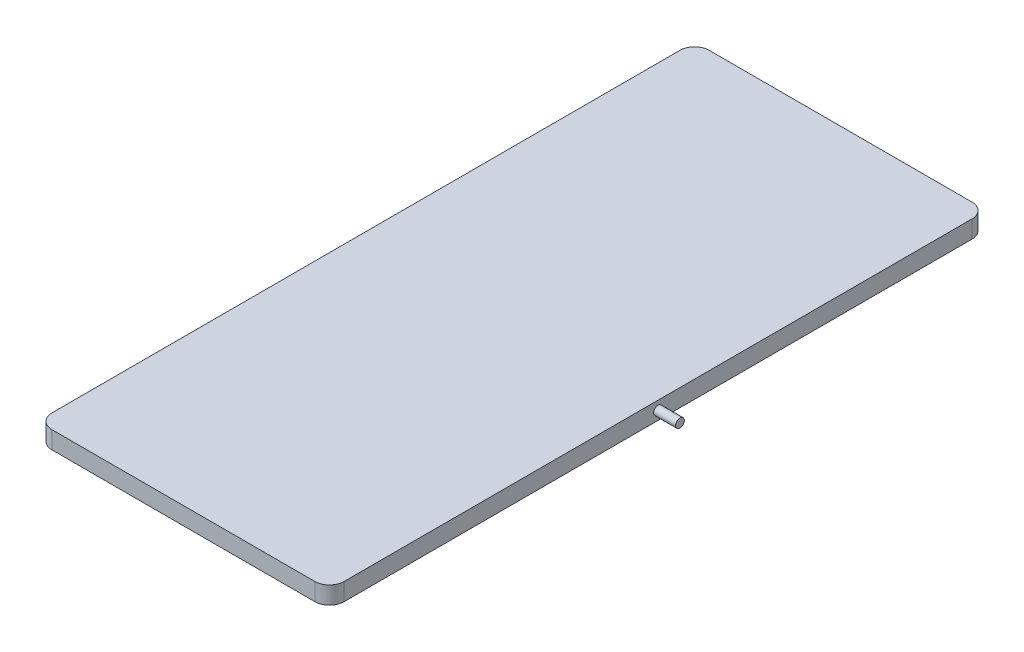
ISO-10303-21;
HEADER;
FILE_DESCRIPTION(('STEP AP214'),'2;1');
FILE_NAME('part.step','',(''),(''),'','','');
FILE_SCHEMA(('AUTOMOTIVE_DESIGN { 1 0 10303 214 1 1 1 1 }'));
ENDSEC;
DATA;
#1=APPLICATION_CONTEXT('core data for automotive mechanical design processes');
#2=APPLICATION_PROTOCOL_DEFINITION('international standard','automotive_design',2000,#1);
#3=PRODUCT_CONTEXT('',#1,'mechanical');
#4=PRODUCT('Part','Part','',(#3));
#5=PRODUCT_RELATED_PRODUCT_CATEGORY('part','',(#4));
#6=PRODUCT_DEFINITION_FORMATION('','',#4);
#7=PRODUCT_DEFINITION_CONTEXT('part definition',#1,'design');
#8=PRODUCT_DEFINITION('design','',#6,#7);
#9=PRODUCT_DEFINITION_SHAPE('','',#8);
#10=(LENGTH_UNIT() NAMED_UNIT(*) SI_UNIT(.MILLI.,.METRE.));
#11=(NAMED_UNIT(*) PLANE_ANGLE_UNIT() SI_UNIT($,.RADIAN.));
#12=(NAMED_UNIT(*) SI_UNIT($,.STERADIAN.) SOLID_ANGLE_UNIT());
#13=UNCERTAINTY_MEASURE_WITH_UNIT(LENGTH_MEASURE(1.E-05),#10,'distance_accuracy_value','');
#14=(GEOMETRIC_REPRESENTATION_CONTEXT(3) GLOBAL_UNCERTAINTY_ASSIGNED_CONTEXT((#13)) GLOBAL_UNIT_ASSIGNED_CONTEXT((#10,
#11,#12)) REPRESENTATION_CONTEXT('',''));
#15=CARTESIAN_POINT('',(0.,0.,0.));
#16=DIRECTION('',(0.,0.,1.));
#17=DIRECTION('',(1.,0.,0.));
#18=AXIS2_PLACEMENT_3D('',#15,#16,#17);
#19=CARTESIAN_POINT('',(-100.,12.,-450.));
#20=DIRECTION('',(1.,0.,0.));
#21=DIRECTION('',(0.,0.,-1.));
#22=AXIS2_PLACEMENT_3D('',#19,#20,#21);
#23=PLANE('',#22);
#24=DIRECTION('',(0.,0.,1.));
#25=VECTOR('',#24,1.);
#26=CARTESIAN_POINT('',(-100.,12.,-450.));
#27=LINE('',#26,#25);
#28=CARTESIAN_POINT('',(-100.,12.,-440.));
#29=VERTEX_POINT('',#28);
#30=CARTESIAN_POINT('',(-100.,12.,-10.));
#31=VERTEX_POINT('',#30);
#32=EDGE_CURVE('E127',#29,#31,#27,.T.);
#33=ORIENTED_EDGE('',*,*,#32,.F.);
#34=DIRECTION('',(0.,-1.,0.));
#35=VECTOR('',#34,1.);
#36=CARTESIAN_POINT('',(-100.,12.,-440.));
#37=LINE('',#36,#35);
#38=CARTESIAN_POINT('',(-100.,0.,-440.));
#39=VERTEX_POINT('',#38);
#40=EDGE_CURVE('E112',#29,#39,#37,.T.);
#41=ORIENTED_EDGE('',*,*,#40,.T.);
#42=DIRECTION('',(0.,0.,1.));
#43=VECTOR('',#42,1.);
#44=CARTESIAN_POINT('',(-100.,0.,-450.));
#45=LINE('',#44,#43);
#46=CARTESIAN_POINT('',(-100.,0.,-10.));
#47=VERTEX_POINT('',#46);
#48=EDGE_CURVE('E124',#39,#47,#45,.T.);
#49=ORIENTED_EDGE('',*,*,#48,.T.);
#50=DIRECTION('',(0.,-1.,0.));
#51=VECTOR('',#50,1.);
#52=CARTESIAN_POINT('',(-100.,12.,-10.));
#53=LINE('',#52,#51);
#54=EDGE_CURVE('E129',#47,#31,#53,.F.);
#55=ORIENTED_EDGE('',*,*,#54,.T.);
#56=EDGE_LOOP('',(#33,#41,#49,#55));
#57=FACE_BOUND('',#56,.T.);
#58=ADVANCED_FACE('F41',(#57),#23,.F.);
#59=CARTESIAN_POINT('',(-100.,12.,0.));
#60=DIRECTION('',(0.,0.,-1.));
#61=DIRECTION('',(-1.,0.,0.));
#62=AXIS2_PLACEMENT_3D('',#59,#60,#61);
#63=PLANE('',#62);
#64=DIRECTION('',(1.,0.,0.));
#65=VECTOR('',#64,1.);
#66=CARTESIAN_POINT('',(-100.,12.,0.));
#67=LINE('',#66,#65);
#68=CARTESIAN_POINT('',(-90.,12.,0.));
#69=VERTEX_POINT('',#68);
#70=CARTESIAN_POINT('',(90.,12.,0.));
#71=VERTEX_POINT('',#70);
#72=EDGE_CURVE('E174',#69,#71,#67,.T.);
#73=ORIENTED_EDGE('',*,*,#72,.F.);
#74=DIRECTION('',(0.,-1.,0.));
#75=VECTOR('',#74,1.);
#76=CARTESIAN_POINT('',(-90.,12.,0.));
#77=LINE('',#76,#75);
#78=CARTESIAN_POINT('',(-90.,0.,0.));
#79=VERTEX_POINT('',#78);
#80=EDGE_CURVE('E49',#69,#79,#77,.T.);
#81=ORIENTED_EDGE('',*,*,#80,.T.);
#82=DIRECTION('',(1.,0.,0.));
#83=VECTOR('',#82,1.);
#84=CARTESIAN_POINT('',(-100.,0.,0.));
#85=LINE('',#84,#83);
#86=CARTESIAN_POINT('',(90.,0.,0.));
#87=VERTEX_POINT('',#86);
#88=EDGE_CURVE('E134',#79,#87,#85,.T.);
#89=ORIENTED_EDGE('',*,*,#88,.T.);
#90=DIRECTION('',(0.,-1.,0.));
#91=VECTOR('',#90,1.);
#92=CARTESIAN_POINT('',(90.,12.,0.));
#93=LINE('',#92,#91);
#94=EDGE_CURVE('E167',#87,#71,#93,.F.);
#95=ORIENTED_EDGE('',*,*,#94,.T.);
#96=EDGE_LOOP('',(#73,#81,#89,#95));
#97=FACE_BOUND('',#96,.T.);
#98=ADVANCED_FACE('F172',(#97),#63,.F.);
#99=CARTESIAN_POINT('',(99.9999999999999,12.,-450.));
#100=DIRECTION('',(-1.,0.,0.));
#101=DIRECTION('',(0.,0.,1.));
#102=AXIS2_PLACEMENT_3D('',#99,#100,#101);
#103=PLANE('',#102);
#104=CARTESIAN_POINT('',(100.,6.00000000000001,-225.));
#105=DIRECTION('',(-1.,0.,0.));
#106=DIRECTION('',(0.,0.,1.));
#107=AXIS2_PLACEMENT_3D('',#104,#105,#106);
#108=CIRCLE('',#107,2.99999999999999);
#109=CARTESIAN_POINT('',(100.,6.00000000000001,-222.));
#110=VERTEX_POINT('',#109);
#111=EDGE_CURVE('E11',#110,#110,#108,.F.);
#112=ORIENTED_EDGE('',*,*,#111,.F.);
#113=EDGE_LOOP('',(#112));
#114=FACE_BOUND('',#113,.T.);
#115=DIRECTION('',(0.,0.,-1.));
#116=VECTOR('',#115,1.);
#117=CARTESIAN_POINT('',(99.9999999999999,0.,-450.));
#118=LINE('',#117,#116);
#119=CARTESIAN_POINT('',(100.,0.,-10.0000000000001));
#120=VERTEX_POINT('',#119);
#121=CARTESIAN_POINT('',(99.9999999999999,0.,-440.));
#122=VERTEX_POINT('',#121);
#123=EDGE_CURVE('E138',#120,#122,#118,.T.);
#124=ORIENTED_EDGE('',*,*,#123,.T.);
#125=DIRECTION('',(0.,-1.,0.));
#126=VECTOR('',#125,1.);
#127=CARTESIAN_POINT('',(99.9999999999999,12.,-440.));
#128=LINE('',#127,#126);
#129=CARTESIAN_POINT('',(99.9999999999999,12.,-440.));
#130=VERTEX_POINT('',#129);
#131=EDGE_CURVE('E56',#122,#130,#128,.F.);
#132=ORIENTED_EDGE('',*,*,#131,.T.);
#133=DIRECTION('',(0.,0.,-1.));
#134=VECTOR('',#133,1.);
#135=CARTESIAN_POINT('',(99.9999999999999,12.,-450.));
#136=LINE('',#135,#134);
#137=CARTESIAN_POINT('',(100.,12.,-10.0000000000001));
#138=VERTEX_POINT('',#137);
#139=EDGE_CURVE('E181',#138,#130,#136,.T.);
#140=ORIENTED_EDGE('',*,*,#139,.F.);
#141=DIRECTION('',(0.,-1.,0.));
#142=VECTOR('',#141,1.);
#143=CARTESIAN_POINT('',(100.,12.,-10.0000000000001));
#144=LINE('',#143,#142);
#145=EDGE_CURVE('E163',#138,#120,#144,.T.);
#146=ORIENTED_EDGE('',*,*,#145,.T.);
#147=EDGE_LOOP('',(#124,#132,#140,#146));
#148=FACE_BOUND('',#147,.T.);
#149=ADVANCED_FACE('F180',(#114,#148),#103,.F.);
#150=CARTESIAN_POINT('',(-100.,12.,-450.));
#151=DIRECTION('',(0.,0.,1.));
#152=DIRECTION('',(1.,0.,0.));
#153=AXIS2_PLACEMENT_3D('',#150,#151,#152);
#154=PLANE('',#153);
#155=DIRECTION('',(-1.,0.,0.));
#156=VECTOR('',#155,1.);
#157=CARTESIAN_POINT('',(-100.,0.,-450.));
#158=LINE('',#157,#156);
#159=CARTESIAN_POINT('',(89.9999999999999,0.,-450.));
#160=VERTEX_POINT('',#159);
#161=CARTESIAN_POINT('',(-90.0000000000001,0.,-450.));
#162=VERTEX_POINT('',#161);
#163=EDGE_CURVE('E147',#160,#162,#158,.T.);
#164=ORIENTED_EDGE('',*,*,#163,.T.);
#165=DIRECTION('',(0.,-1.,0.));
#166=VECTOR('',#165,1.);
#167=CARTESIAN_POINT('',(-90.0000000000001,12.,-450.));
#168=LINE('',#167,#166);
#169=CARTESIAN_POINT('',(-90.0000000000001,12.,-450.));
#170=VERTEX_POINT('',#169);
#171=EDGE_CURVE('E113',#162,#170,#168,.F.);
#172=ORIENTED_EDGE('',*,*,#171,.T.);
#173=DIRECTION('',(-1.,0.,0.));
#174=VECTOR('',#173,1.);
#175=CARTESIAN_POINT('',(-100.,12.,-450.));
#176=LINE('',#175,#174);
#177=CARTESIAN_POINT('',(89.9999999999999,12.,-450.));
#178=VERTEX_POINT('',#177);
#179=EDGE_CURVE('E143',#178,#170,#176,.T.);
#180=ORIENTED_EDGE('',*,*,#179,.F.);
#181=DIRECTION('',(0.,-1.,0.));
#182=VECTOR('',#181,1.);
#183=CARTESIAN_POINT('',(89.9999999999999,12.,-450.));
#184=LINE('',#183,#182);
#185=EDGE_CURVE('E118',#178,#160,#184,.T.);
#186=ORIENTED_EDGE('',*,*,#185,.T.);
#187=EDGE_LOOP('',(#164,#172,#180,#186));
#188=FACE_BOUND('',#187,.T.);
#189=ADVANCED_FACE('F213',(#188),#154,.F.);
#190=CARTESIAN_POINT('',(0.,12.,0.));
#191=DIRECTION('',(0.,1.,0.));
#192=DIRECTION('',(0.,0.,1.));
#193=AXIS2_PLACEMENT_3D('',#190,#191,#192);
#194=PLANE('',#193);
#195=ORIENTED_EDGE('',*,*,#179,.T.);
#196=CARTESIAN_POINT('',(-90.0000000000001,12.,-440.));
#197=DIRECTION('',(0.,1.,0.));
#198=DIRECTION('',(0.,0.,1.));
#199=AXIS2_PLACEMENT_3D('',#196,#197,#198);
#200=CIRCLE('',#199,10.);
#201=EDGE_CURVE('E161',#170,#29,#200,.T.);
#202=ORIENTED_EDGE('',*,*,#201,.T.);
#203=ORIENTED_EDGE('',*,*,#32,.T.);
#204=CARTESIAN_POINT('',(-90.,12.,-10.));
#205=DIRECTION('',(0.,1.,0.));
#206=DIRECTION('',(0.,0.,1.));
#207=AXIS2_PLACEMENT_3D('',#204,#205,#206);
#208=CIRCLE('',#207,10.);
#209=EDGE_CURVE('E157',#31,#69,#208,.T.);
#210=ORIENTED_EDGE('',*,*,#209,.T.);
#211=ORIENTED_EDGE('',*,*,#72,.T.);
#212=CARTESIAN_POINT('',(90.,12.,-10.0000000000001));
#213=DIRECTION('',(0.,1.,0.));
#214=DIRECTION('',(0.,0.,1.));
#215=AXIS2_PLACEMENT_3D('',#212,#213,#214);
#216=CIRCLE('',#215,10.);
#217=EDGE_CURVE('E63',#71,#138,#216,.T.);
#218=ORIENTED_EDGE('',*,*,#217,.T.);
#219=ORIENTED_EDGE('',*,*,#139,.T.);
#220=CARTESIAN_POINT('',(89.9999999999999,12.,-440.));
#221=DIRECTION('',(0.,1.,0.));
#222=DIRECTION('',(0.,0.,1.));
#223=AXIS2_PLACEMENT_3D('',#220,#221,#222);
#224=CIRCLE('',#223,10.);
#225=EDGE_CURVE('E159',#130,#178,#224,.T.);
#226=ORIENTED_EDGE('',*,*,#225,.T.);
#227=EDGE_LOOP('',(#195,#202,#203,#210,#211,#218,#219,#226));
#228=FACE_BOUND('',#227,.T.);
#229=ADVANCED_FACE('F186',(#228),#194,.T.);
#230=CARTESIAN_POINT('',(0.,0.,0.));
#231=DIRECTION('',(0.,1.,0.));
#232=DIRECTION('',(0.,0.,1.));
#233=AXIS2_PLACEMENT_3D('',#230,#231,#232);
#234=PLANE('',#233);
#235=ORIENTED_EDGE('',*,*,#48,.F.);
#236=CARTESIAN_POINT('',(-90.0000000000001,0.,-440.));
#237=DIRECTION('',(0.,1.,0.));
#238=DIRECTION('',(0.,0.,1.));
#239=AXIS2_PLACEMENT_3D('',#236,#237,#238);
#240=CIRCLE('',#239,10.);
#241=EDGE_CURVE('E108',#39,#162,#240,.F.);
#242=ORIENTED_EDGE('',*,*,#241,.T.);
#243=ORIENTED_EDGE('',*,*,#163,.F.);
#244=CARTESIAN_POINT('',(89.9999999999999,0.,-440.));
#245=DIRECTION('',(0.,1.,0.));
#246=DIRECTION('',(0.,0.,1.));
#247=AXIS2_PLACEMENT_3D('',#244,#245,#246);
#248=CIRCLE('',#247,10.);
#249=EDGE_CURVE('E119',#160,#122,#248,.F.);
#250=ORIENTED_EDGE('',*,*,#249,.T.);
#251=ORIENTED_EDGE('',*,*,#123,.F.);
#252=CARTESIAN_POINT('',(90.,0.,-10.0000000000001));
#253=DIRECTION('',(0.,1.,0.));
#254=DIRECTION('',(0.,0.,1.));
#255=AXIS2_PLACEMENT_3D('',#252,#253,#254);
#256=CIRCLE('',#255,10.);
#257=EDGE_CURVE('E128',#120,#87,#256,.F.);
#258=ORIENTED_EDGE('',*,*,#257,.T.);
#259=ORIENTED_EDGE('',*,*,#88,.F.);
#260=CARTESIAN_POINT('',(-90.,0.,-10.));
#261=DIRECTION('',(0.,1.,0.));
#262=DIRECTION('',(0.,0.,1.));
#263=AXIS2_PLACEMENT_3D('',#260,#261,#262);
#264=CIRCLE('',#263,10.);
#265=EDGE_CURVE('E133',#79,#47,#264,.F.);
#266=ORIENTED_EDGE('',*,*,#265,.T.);
#267=EDGE_LOOP('',(#235,#242,#243,#250,#251,#258,#259,#266));
#268=FACE_BOUND('',#267,.T.);
#269=ADVANCED_FACE('F131',(#268),#234,.F.);
#270=CARTESIAN_POINT('',(-90.0000000000001,12.,-440.));
#271=DIRECTION('',(0.,-1.,0.));
#272=DIRECTION('',(0.,0.,-1.));
#273=AXIS2_PLACEMENT_3D('',#270,#271,#272);
#274=CYLINDRICAL_SURFACE('',#273,10.);
#275=ORIENTED_EDGE('',*,*,#201,.F.);
#276=ORIENTED_EDGE('',*,*,#171,.F.);
#277=ORIENTED_EDGE('',*,*,#241,.F.);
#278=ORIENTED_EDGE('',*,*,#40,.F.);
#279=EDGE_LOOP('',(#275,#276,#277,#278));
#280=FACE_BOUND('',#279,.T.);
#281=ADVANCED_FACE('F111',(#280),#274,.T.);
#282=CARTESIAN_POINT('',(89.9999999999999,12.,-440.));
#283=DIRECTION('',(0.,-1.,0.));
#284=DIRECTION('',(0.,0.,-1.));
#285=AXIS2_PLACEMENT_3D('',#282,#283,#284);
#286=CYLINDRICAL_SURFACE('',#285,10.);
#287=ORIENTED_EDGE('',*,*,#225,.F.);
#288=ORIENTED_EDGE('',*,*,#131,.F.);
#289=ORIENTED_EDGE('',*,*,#249,.F.);
#290=ORIENTED_EDGE('',*,*,#185,.F.);
#291=EDGE_LOOP('',(#287,#288,#289,#290));
#292=FACE_BOUND('',#291,.T.);
#293=ADVANCED_FACE('F189',(#292),#286,.T.);
#294=CARTESIAN_POINT('',(-90.,12.,-10.));
#295=DIRECTION('',(0.,-1.,0.));
#296=DIRECTION('',(0.,0.,-1.));
#297=AXIS2_PLACEMENT_3D('',#294,#295,#296);
#298=CYLINDRICAL_SURFACE('',#297,10.);
#299=ORIENTED_EDGE('',*,*,#209,.F.);
#300=ORIENTED_EDGE('',*,*,#54,.F.);
#301=ORIENTED_EDGE('',*,*,#265,.F.);
#302=ORIENTED_EDGE('',*,*,#80,.F.);
#303=EDGE_LOOP('',(#299,#300,#301,#302));
#304=FACE_BOUND('',#303,.T.);
#305=ADVANCED_FACE('F187',(#304),#298,.T.);
#306=CARTESIAN_POINT('',(90.,12.,-10.0000000000001));
#307=DIRECTION('',(0.,-1.,0.));
#308=DIRECTION('',(0.,0.,-1.));
#309=AXIS2_PLACEMENT_3D('',#306,#307,#308);
#310=CYLINDRICAL_SURFACE('',#309,10.);
#311=ORIENTED_EDGE('',*,*,#217,.F.);
#312=ORIENTED_EDGE('',*,*,#94,.F.);
#313=ORIENTED_EDGE('',*,*,#257,.F.);
#314=ORIENTED_EDGE('',*,*,#145,.F.);
#315=EDGE_LOOP('',(#311,#312,#313,#314));
#316=FACE_BOUND('',#315,.T.);
#317=ADVANCED_FACE('F43',(#316),#310,.T.);
#318=CARTESIAN_POINT('',(115.,6.00000000000001,-225.));
#319=DIRECTION('',(-1.,0.,0.));
#320=DIRECTION('',(0.,0.,1.));
#321=AXIS2_PLACEMENT_3D('',#318,#319,#320);
#322=CYLINDRICAL_SURFACE('',#321,2.99999999999999);
#323=CARTESIAN_POINT('',(115.,6.00000000000001,-225.));
#324=DIRECTION('',(1.,0.,0.));
#325=DIRECTION('',(0.,0.,-1.));
#326=AXIS2_PLACEMENT_3D('',#323,#324,#325);
#327=CIRCLE('',#326,2.99999999999999);
#328=CARTESIAN_POINT('',(115.,6.00000000000001,-228.));
#329=VERTEX_POINT('',#328);
#330=EDGE_CURVE('E135',#329,#329,#327,.T.);
#331=ORIENTED_EDGE('',*,*,#330,.F.);
#332=EDGE_LOOP('',(#331));
#333=FACE_BOUND('',#332,.T.);
#334=ORIENTED_EDGE('',*,*,#111,.T.);
#335=EDGE_LOOP('',(#334));
#336=FACE_BOUND('',#335,.T.);
#337=ADVANCED_FACE('F194',(#333,#336),#322,.T.);
#338=CARTESIAN_POINT('',(115.,6.00000000000001,-225.));
#339=DIRECTION('',(1.,0.,0.));
#340=DIRECTION('',(0.,0.,-1.));
#341=AXIS2_PLACEMENT_3D('',#338,#339,#340);
#342=PLANE('',#341);
#343=ORIENTED_EDGE('',*,*,#330,.T.);
#344=EDGE_LOOP('',(#343));
#345=FACE_BOUND('',#344,.T.);
#346=ADVANCED_FACE('F226',(#345),#342,.T.);
#347=CLOSED_SHELL('',(#58,#98,#149,#189,#229,#269,#281,#293,#305,#317,#337,#346));
#348=MANIFOLD_SOLID_BREP('B2',#347);
#349=ADVANCED_BREP_SHAPE_REPRESENTATION('',(#18,#348),#14);
#350=SHAPE_DEFINITION_REPRESENTATION(#9,#349);
ENDSEC;
END-ISO-10303-21;
